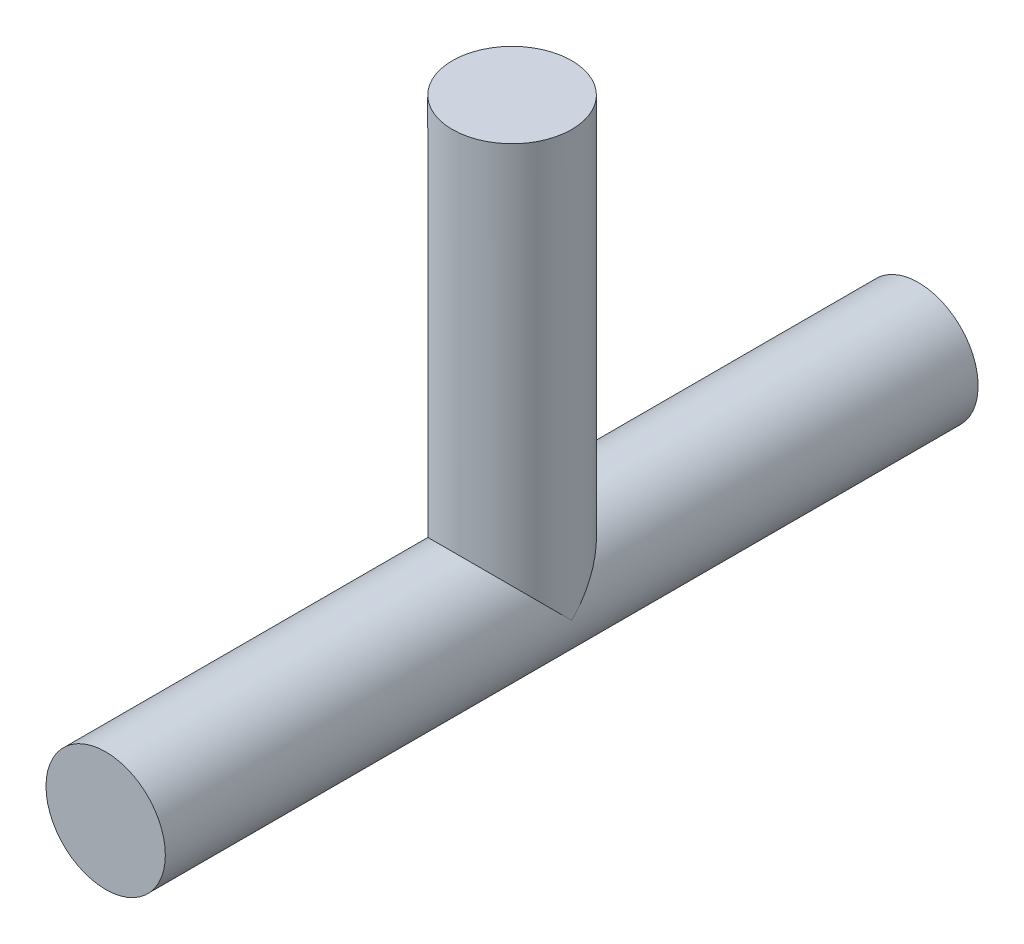
ISO-10303-21;
HEADER;
FILE_DESCRIPTION(('STEP AP214'),'2;1');
FILE_NAME('part.step','',(''),(''),'','','');
FILE_SCHEMA(('AUTOMOTIVE_DESIGN { 1 0 10303 214 1 1 1 1 }'));
ENDSEC;
DATA;
#1=APPLICATION_CONTEXT('core data for automotive mechanical design processes');
#2=APPLICATION_PROTOCOL_DEFINITION('international standard','automotive_design',2000,#1);
#3=PRODUCT_CONTEXT('',#1,'mechanical');
#4=PRODUCT('Part','Part','',(#3));
#5=PRODUCT_RELATED_PRODUCT_CATEGORY('part','',(#4));
#6=PRODUCT_DEFINITION_FORMATION('','',#4);
#7=PRODUCT_DEFINITION_CONTEXT('part definition',#1,'design');
#8=PRODUCT_DEFINITION('design','',#6,#7);
#9=PRODUCT_DEFINITION_SHAPE('','',#8);
#10=(LENGTH_UNIT() NAMED_UNIT(*) SI_UNIT(.MILLI.,.METRE.));
#11=(NAMED_UNIT(*) PLANE_ANGLE_UNIT() SI_UNIT($,.RADIAN.));
#12=(NAMED_UNIT(*) SI_UNIT($,.STERADIAN.) SOLID_ANGLE_UNIT());
#13=UNCERTAINTY_MEASURE_WITH_UNIT(LENGTH_MEASURE(1.E-05),#10,'distance_accuracy_value','');
#14=(GEOMETRIC_REPRESENTATION_CONTEXT(3) GLOBAL_UNCERTAINTY_ASSIGNED_CONTEXT((#13)) GLOBAL_UNIT_ASSIGNED_CONTEXT((#10,
#11,#12)) REPRESENTATION_CONTEXT('',''));
#15=CARTESIAN_POINT('',(0.,0.,0.));
#16=DIRECTION('',(0.,0.,1.));
#17=DIRECTION('',(1.,0.,0.));
#18=AXIS2_PLACEMENT_3D('',#15,#16,#17);
#19=CARTESIAN_POINT('',(5.81225723995687E-09,136.654152379138,0.));
#20=DIRECTION('',(0.,1.,0.));
#21=DIRECTION('',(0.,0.,1.));
#22=AXIS2_PLACEMENT_3D('',#19,#20,#21);
#23=PLANE('',#22);
#24=CARTESIAN_POINT('',(5.81225723995687E-09,136.654152379138,0.));
#25=DIRECTION('',(0.,1.,0.));
#26=DIRECTION('',(0.,0.,1.));
#27=AXIS2_PLACEMENT_3D('',#24,#25,#26);
#28=CIRCLE('',#27,19.22);
#29=CARTESIAN_POINT('',(5.81225723995687E-09,136.654152379138,19.22));
#30=VERTEX_POINT('',#29);
#31=EDGE_CURVE('E66',#30,#30,#28,.T.);
#32=ORIENTED_EDGE('',*,*,#31,.T.);
#33=EDGE_LOOP('',(#32));
#34=FACE_BOUND('',#33,.T.);
#35=ADVANCED_FACE('F40',(#34),#23,.T.);
#36=CARTESIAN_POINT('',(5.81225723995687E-09,-0.305847620861716,-130.9));
#37=DIRECTION('',(0.,0.,-1.));
#38=DIRECTION('',(-1.,0.,0.));
#39=AXIS2_PLACEMENT_3D('',#36,#37,#38);
#40=PLANE('',#39);
#41=CARTESIAN_POINT('',(5.81225723995687E-09,-0.305847620861716,-130.9));
#42=DIRECTION('',(0.,0.,-1.));
#43=DIRECTION('',(-1.,0.,0.));
#44=AXIS2_PLACEMENT_3D('',#41,#42,#43);
#45=CIRCLE('',#44,19.22);
#46=CARTESIAN_POINT('',(-19.2199999941877,-0.305847620861716,-130.9));
#47=VERTEX_POINT('',#46);
#48=EDGE_CURVE('E68',#47,#47,#45,.T.);
#49=ORIENTED_EDGE('',*,*,#48,.T.);
#50=EDGE_LOOP('',(#49));
#51=FACE_BOUND('',#50,.T.);
#52=ADVANCED_FACE('F63',(#51),#40,.T.);
#53=CARTESIAN_POINT('',(5.81225723995687E-09,136.854152379138,0.));
#54=DIRECTION('',(0.,-1.,0.));
#55=DIRECTION('',(0.,0.,-1.));
#56=AXIS2_PLACEMENT_3D('',#53,#54,#55);
#57=CYLINDRICAL_SURFACE('',#56,19.22);
#58=CARTESIAN_POINT('',(5.81225723995687E-09,-0.305847620861715,0.));
#59=DIRECTION('',(0.,0.707106781186547,-0.707106781186547));
#60=DIRECTION('',(0.,-0.707106781186547,-0.707106781186547));
#61=AXIS2_PLACEMENT_3D('',#58,#59,#60);
#62=ELLIPSE('',#61,27.1811846688109,19.22);
#63=CARTESIAN_POINT('',(19.2200000058123,-0.305847620861714,0.));
#64=VERTEX_POINT('',#63);
#65=CARTESIAN_POINT('',(-19.2199999941877,-0.305847620861716,0.));
#66=VERTEX_POINT('',#65);
#67=EDGE_CURVE('E12',#64,#66,#62,.F.);
#68=ORIENTED_EDGE('',*,*,#67,.F.);
#69=CARTESIAN_POINT('',(5.81225723995687E-09,-0.305847620861715,0.));
#70=DIRECTION('',(0.,-0.707106781186547,-0.707106781186547));
#71=DIRECTION('',(0.,0.707106781186547,-0.707106781186547));
#72=AXIS2_PLACEMENT_3D('',#69,#70,#71);
#73=ELLIPSE('',#72,27.1811846688109,19.22);
#74=EDGE_CURVE('E48',#66,#64,#73,.T.);
#75=ORIENTED_EDGE('',*,*,#74,.F.);
#76=EDGE_LOOP('',(#68,#75));
#77=FACE_BOUND('',#76,.T.);
#78=ORIENTED_EDGE('',*,*,#31,.F.);
#79=EDGE_LOOP('',(#78));
#80=FACE_BOUND('',#79,.T.);
#81=ADVANCED_FACE('F59',(#77,#80),#57,.T.);
#82=CARTESIAN_POINT('',(5.81225723995687E-09,-0.305847620861716,130.9));
#83=DIRECTION('',(0.,0.,1.));
#84=DIRECTION('',(1.,0.,0.));
#85=AXIS2_PLACEMENT_3D('',#82,#83,#84);
#86=PLANE('',#85);
#87=CARTESIAN_POINT('',(5.81225723995687E-09,-0.305847620861716,130.9));
#88=DIRECTION('',(0.,0.,1.));
#89=DIRECTION('',(1.,0.,0.));
#90=AXIS2_PLACEMENT_3D('',#87,#88,#89);
#91=CIRCLE('',#90,19.22);
#92=CARTESIAN_POINT('',(19.2200000058123,-0.305847620861716,130.9));
#93=VERTEX_POINT('',#92);
#94=EDGE_CURVE('E43',#93,#93,#91,.T.);
#95=ORIENTED_EDGE('',*,*,#94,.T.);
#96=EDGE_LOOP('',(#95));
#97=FACE_BOUND('',#96,.T.);
#98=ADVANCED_FACE('F62',(#97),#86,.T.);
#99=CARTESIAN_POINT('',(5.81225723995687E-09,-0.305847620861716,131.1));
#100=DIRECTION('',(0.,0.,-1.));
#101=DIRECTION('',(-1.,0.,0.));
#102=AXIS2_PLACEMENT_3D('',#99,#100,#101);
#103=CYLINDRICAL_SURFACE('',#102,19.22);
#104=ORIENTED_EDGE('',*,*,#74,.T.);
#105=ORIENTED_EDGE('',*,*,#67,.T.);
#106=EDGE_LOOP('',(#104,#105));
#107=FACE_BOUND('',#106,.T.);
#108=ORIENTED_EDGE('',*,*,#48,.F.);
#109=EDGE_LOOP('',(#108));
#110=FACE_BOUND('',#109,.T.);
#111=ORIENTED_EDGE('',*,*,#94,.F.);
#112=EDGE_LOOP('',(#111));
#113=FACE_BOUND('',#112,.T.);
#114=ADVANCED_FACE('F55',(#107,#110,#113),#103,.T.);
#115=CLOSED_SHELL('',(#35,#52,#81,#98,#114));
#116=MANIFOLD_SOLID_BREP('B2',#115);
#117=ADVANCED_BREP_SHAPE_REPRESENTATION('',(#18,#116),#14);
#118=SHAPE_DEFINITION_REPRESENTATION(#9,#117);
ENDSEC;
END-ISO-10303-21;
